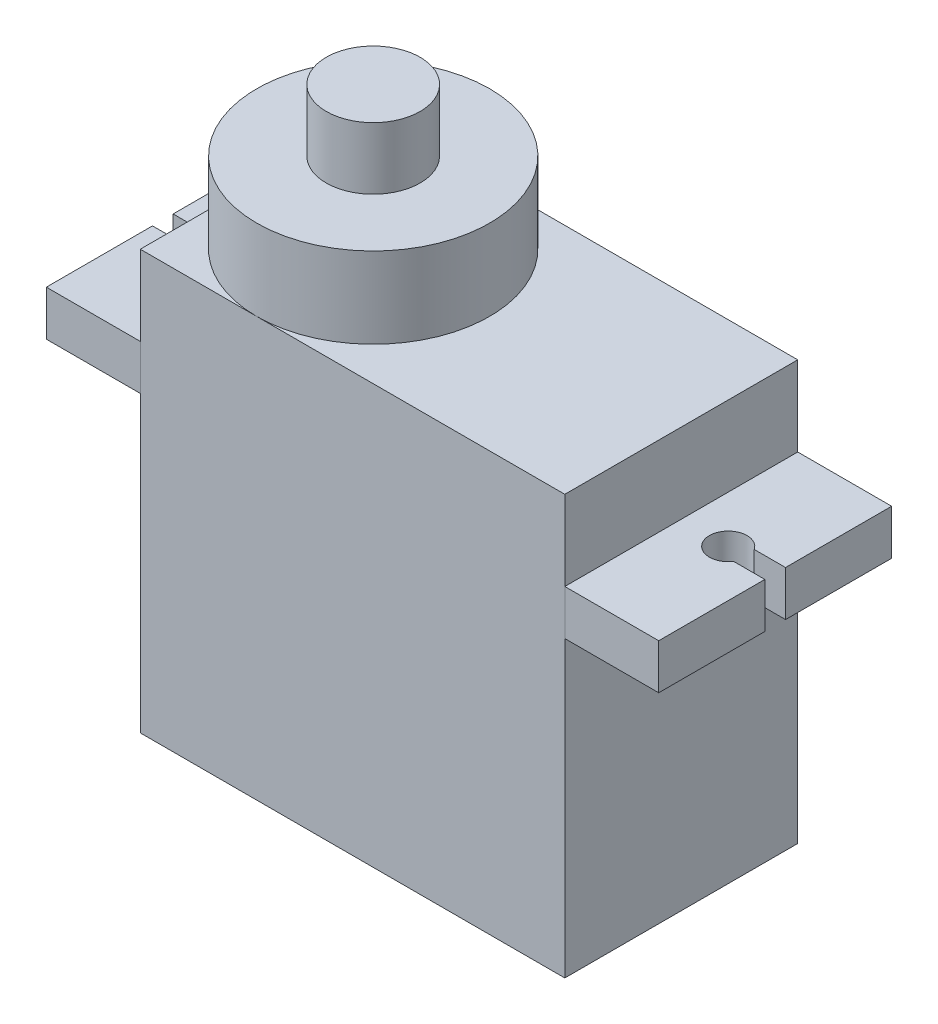
ISO-10303-21;
HEADER;
FILE_DESCRIPTION(('STEP AP214'),'2;1');
FILE_NAME('part.step','',(''),(''),'','','');
FILE_SCHEMA(('AUTOMOTIVE_DESIGN { 1 0 10303 214 1 1 1 1 }'));
ENDSEC;
DATA;
#1=APPLICATION_CONTEXT('core data for automotive mechanical design processes');
#2=APPLICATION_PROTOCOL_DEFINITION('international standard','automotive_design',2000,#1);
#3=PRODUCT_CONTEXT('',#1,'mechanical');
#4=PRODUCT('Part','Part','',(#3));
#5=PRODUCT_RELATED_PRODUCT_CATEGORY('part','',(#4));
#6=PRODUCT_DEFINITION_FORMATION('','',#4);
#7=PRODUCT_DEFINITION_CONTEXT('part definition',#1,'design');
#8=PRODUCT_DEFINITION('design','',#6,#7);
#9=PRODUCT_DEFINITION_SHAPE('','',#8);
#10=(LENGTH_UNIT() NAMED_UNIT(*) SI_UNIT(.MILLI.,.METRE.));
#11=(NAMED_UNIT(*) PLANE_ANGLE_UNIT() SI_UNIT($,.RADIAN.));
#12=(NAMED_UNIT(*) SI_UNIT($,.STERADIAN.) SOLID_ANGLE_UNIT());
#13=UNCERTAINTY_MEASURE_WITH_UNIT(LENGTH_MEASURE(1.E-05),#10,'distance_accuracy_value','');
#14=(GEOMETRIC_REPRESENTATION_CONTEXT(3) GLOBAL_UNCERTAINTY_ASSIGNED_CONTEXT((#13)) GLOBAL_UNIT_ASSIGNED_CONTEXT((#10,
#11,#12)) REPRESENTATION_CONTEXT('',''));
#15=CARTESIAN_POINT('',(0.,0.,0.));
#16=DIRECTION('',(0.,0.,1.));
#17=DIRECTION('',(1.,0.,0.));
#18=AXIS2_PLACEMENT_3D('',#15,#16,#17);
#19=CARTESIAN_POINT('',(-13.6,4.5,-1.2));
#20=DIRECTION('',(1.,0.,0.));
#21=DIRECTION('',(0.,0.,-1.));
#22=AXIS2_PLACEMENT_3D('',#19,#20,#21);
#23=CYLINDRICAL_SURFACE('',#22,0.6);
#24=CARTESIAN_POINT('',(-11.3,4.5,-1.2));
#25=DIRECTION('',(-1.,0.,0.));
#26=DIRECTION('',(0.,0.,1.));
#27=AXIS2_PLACEMENT_3D('',#24,#25,#26);
#28=CIRCLE('',#27,0.6);
#29=CARTESIAN_POINT('',(-11.3,4.5,-0.6));
#30=VERTEX_POINT('',#29);
#31=EDGE_CURVE('E11',#30,#30,#28,.T.);
#32=ORIENTED_EDGE('',*,*,#31,.T.);
#33=EDGE_LOOP('',(#32));
#34=FACE_BOUND('',#33,.T.);
#35=CARTESIAN_POINT('',(-13.6,4.5,-1.2));
#36=DIRECTION('',(-1.,0.,0.));
#37=DIRECTION('',(0.,0.,1.));
#38=AXIS2_PLACEMENT_3D('',#35,#36,#37);
#39=CIRCLE('',#38,0.6);
#40=CARTESIAN_POINT('',(-13.6,4.5,-0.6));
#41=VERTEX_POINT('',#40);
#42=EDGE_CURVE('E60',#41,#41,#39,.T.);
#43=ORIENTED_EDGE('',*,*,#42,.F.);
#44=EDGE_LOOP('',(#43));
#45=FACE_BOUND('',#44,.T.);
#46=ADVANCED_FACE('F56',(#34,#45),#23,.T.);
#47=CARTESIAN_POINT('',(-13.6,0.,0.));
#48=DIRECTION('',(-1.,0.,0.));
#49=DIRECTION('',(0.,0.,1.));
#50=AXIS2_PLACEMENT_3D('',#47,#48,#49);
#51=PLANE('',#50);
#52=ORIENTED_EDGE('',*,*,#42,.T.);
#53=EDGE_LOOP('',(#52));
#54=FACE_BOUND('',#53,.T.);
#55=ADVANCED_FACE('F58',(#54),#51,.T.);
#56=CARTESIAN_POINT('',(-11.3,0.,0.));
#57=DIRECTION('',(-1.,0.,0.));
#58=DIRECTION('',(0.,0.,1.));
#59=AXIS2_PLACEMENT_3D('',#56,#57,#58);
#60=PLANE('',#59);
#61=ORIENTED_EDGE('',*,*,#31,.F.);
#62=EDGE_LOOP('',(#61));
#63=FACE_BOUND('',#62,.T.);
#64=ADVANCED_FACE('F75',(#63),#60,.F.);
#65=CLOSED_SHELL('',(#46,#55,#64));
#66=MANIFOLD_SOLID_BREP('B2',#65);
#67=CARTESIAN_POINT('',(-13.6,4.5,0.));
#68=DIRECTION('',(1.,0.,0.));
#69=DIRECTION('',(0.,0.,-1.));
#70=AXIS2_PLACEMENT_3D('',#67,#68,#69);
#71=CYLINDRICAL_SURFACE('',#70,0.6);
#72=CARTESIAN_POINT('',(-11.3,4.5,0.));
#73=DIRECTION('',(-1.,0.,0.));
#74=DIRECTION('',(0.,0.,1.));
#75=AXIS2_PLACEMENT_3D('',#72,#73,#74);
#76=CIRCLE('',#75,0.6);
#77=CARTESIAN_POINT('',(-11.3,4.5,0.6));
#78=VERTEX_POINT('',#77);
#79=EDGE_CURVE('E55',#78,#78,#76,.T.);
#80=ORIENTED_EDGE('',*,*,#79,.T.);
#81=EDGE_LOOP('',(#80));
#82=FACE_BOUND('',#81,.T.);
#83=CARTESIAN_POINT('',(-13.6,4.5,0.));
#84=DIRECTION('',(-1.,0.,0.));
#85=DIRECTION('',(0.,0.,1.));
#86=AXIS2_PLACEMENT_3D('',#83,#84,#85);
#87=CIRCLE('',#86,0.6);
#88=CARTESIAN_POINT('',(-13.6,4.5,0.6));
#89=VERTEX_POINT('',#88);
#90=EDGE_CURVE('E109',#89,#89,#87,.T.);
#91=ORIENTED_EDGE('',*,*,#90,.F.);
#92=EDGE_LOOP('',(#91));
#93=FACE_BOUND('',#92,.T.);
#94=ADVANCED_FACE('F105',(#82,#93),#71,.T.);
#95=CARTESIAN_POINT('',(-13.6,0.,0.));
#96=DIRECTION('',(-1.,0.,0.));
#97=DIRECTION('',(0.,0.,1.));
#98=AXIS2_PLACEMENT_3D('',#95,#96,#97);
#99=PLANE('',#98);
#100=ORIENTED_EDGE('',*,*,#90,.T.);
#101=EDGE_LOOP('',(#100));
#102=FACE_BOUND('',#101,.T.);
#103=ADVANCED_FACE('F107',(#102),#99,.T.);
#104=CARTESIAN_POINT('',(-11.3,0.,0.));
#105=DIRECTION('',(-1.,0.,0.));
#106=DIRECTION('',(0.,0.,1.));
#107=AXIS2_PLACEMENT_3D('',#104,#105,#106);
#108=PLANE('',#107);
#109=ORIENTED_EDGE('',*,*,#79,.F.);
#110=EDGE_LOOP('',(#109));
#111=FACE_BOUND('',#110,.T.);
#112=ADVANCED_FACE('F124',(#111),#108,.F.);
#113=CLOSED_SHELL('',(#94,#103,#112));
#114=MANIFOLD_SOLID_BREP('B6',#113);
#115=CARTESIAN_POINT('',(-13.6,4.5,1.2));
#116=DIRECTION('',(1.,0.,0.));
#117=DIRECTION('',(0.,0.,-1.));
#118=AXIS2_PLACEMENT_3D('',#115,#116,#117);
#119=CYLINDRICAL_SURFACE('',#118,0.6);
#120=CARTESIAN_POINT('',(-11.3,4.5,1.2));
#121=DIRECTION('',(-1.,0.,0.));
#122=DIRECTION('',(0.,0.,1.));
#123=AXIS2_PLACEMENT_3D('',#120,#121,#122);
#124=CIRCLE('',#123,0.6);
#125=CARTESIAN_POINT('',(-11.3,4.5,1.8));
#126=VERTEX_POINT('',#125);
#127=EDGE_CURVE('E159',#126,#126,#124,.T.);
#128=ORIENTED_EDGE('',*,*,#127,.T.);
#129=EDGE_LOOP('',(#128));
#130=FACE_BOUND('',#129,.T.);
#131=CARTESIAN_POINT('',(-13.6,4.5,1.2));
#132=DIRECTION('',(-1.,0.,0.));
#133=DIRECTION('',(0.,0.,1.));
#134=AXIS2_PLACEMENT_3D('',#131,#132,#133);
#135=CIRCLE('',#134,0.6);
#136=CARTESIAN_POINT('',(-13.6,4.5,1.8));
#137=VERTEX_POINT('',#136);
#138=EDGE_CURVE('E104',#137,#137,#135,.T.);
#139=ORIENTED_EDGE('',*,*,#138,.F.);
#140=EDGE_LOOP('',(#139));
#141=FACE_BOUND('',#140,.T.);
#142=ADVANCED_FACE('F156',(#130,#141),#119,.T.);
#143=CARTESIAN_POINT('',(-13.6,4.5,1.2));
#144=DIRECTION('',(-1.,0.,0.));
#145=DIRECTION('',(0.,0.,1.));
#146=AXIS2_PLACEMENT_3D('',#143,#144,#145);
#147=PLANE('',#146);
#148=ORIENTED_EDGE('',*,*,#138,.T.);
#149=EDGE_LOOP('',(#148));
#150=FACE_BOUND('',#149,.T.);
#151=ADVANCED_FACE('F172',(#150),#147,.T.);
#152=CARTESIAN_POINT('',(-11.3,4.5,1.2));
#153=DIRECTION('',(-1.,0.,0.));
#154=DIRECTION('',(0.,0.,1.));
#155=AXIS2_PLACEMENT_3D('',#152,#153,#154);
#156=PLANE('',#155);
#157=ORIENTED_EDGE('',*,*,#127,.F.);
#158=EDGE_LOOP('',(#157));
#159=FACE_BOUND('',#158,.T.);
#160=ADVANCED_FACE('F170',(#159),#156,.F.);
#161=CLOSED_SHELL('',(#142,#151,#160));
#162=MANIFOLD_SOLID_BREP('B50',#161);
#163=CARTESIAN_POINT('',(-16.3,18.05,-6.2));
#164=DIRECTION('',(-1.,0.,0.));
#165=DIRECTION('',(0.,0.,1.));
#166=AXIS2_PLACEMENT_3D('',#163,#164,#165);
#167=PLANE('',#166);
#168=DIRECTION('',(0.,1.,0.));
#169=VECTOR('',#168,1.);
#170=CARTESIAN_POINT('',(-16.3,0.,0.550000000000012));
#171=LINE('',#170,#169);
#172=CARTESIAN_POINT('',(-16.3,15.65,0.550000000000012));
#173=VERTEX_POINT('',#172);
#174=CARTESIAN_POINT('',(-16.3,18.05,0.550000000000012));
#175=VERTEX_POINT('',#174);
#176=EDGE_CURVE('E295',#173,#175,#171,.T.);
#177=ORIENTED_EDGE('',*,*,#176,.F.);
#178=DIRECTION('',(0.,0.,1.));
#179=VECTOR('',#178,1.);
#180=CARTESIAN_POINT('',(-16.3,15.65,-6.2));
#181=LINE('',#180,#179);
#182=CARTESIAN_POINT('',(-16.3,15.65,6.2));
#183=VERTEX_POINT('',#182);
#184=EDGE_CURVE('E300',#173,#183,#181,.T.);
#185=ORIENTED_EDGE('',*,*,#184,.T.);
#186=DIRECTION('',(0.,-1.,0.));
#187=VECTOR('',#186,1.);
#188=CARTESIAN_POINT('',(-16.3,18.05,6.2));
#189=LINE('',#188,#187);
#190=CARTESIAN_POINT('',(-16.3,18.05,6.2));
#191=VERTEX_POINT('',#190);
#192=EDGE_CURVE('E308',#191,#183,#189,.T.);
#193=ORIENTED_EDGE('',*,*,#192,.F.);
#194=DIRECTION('',(0.,0.,1.));
#195=VECTOR('',#194,1.);
#196=CARTESIAN_POINT('',(-16.3,18.05,-6.2));
#197=LINE('',#196,#195);
#198=EDGE_CURVE('E301',#175,#191,#197,.T.);
#199=ORIENTED_EDGE('',*,*,#198,.F.);
#200=EDGE_LOOP('',(#177,#185,#193,#199));
#201=FACE_BOUND('',#200,.T.);
#202=ADVANCED_FACE('F207',(#201),#167,.T.);
#203=CARTESIAN_POINT('',(-11.3,18.05,-6.2));
#204=DIRECTION('',(1.,0.,0.));
#205=DIRECTION('',(0.,0.,-1.));
#206=AXIS2_PLACEMENT_3D('',#203,#204,#205);
#207=PLANE('',#206);
#208=DIRECTION('',(0.,1.,0.));
#209=VECTOR('',#208,1.);
#210=CARTESIAN_POINT('',(-11.3,18.05,6.2));
#211=LINE('',#210,#209);
#212=CARTESIAN_POINT('',(-11.3,15.65,6.2));
#213=VERTEX_POINT('',#212);
#214=CARTESIAN_POINT('',(-11.3,18.05,6.2));
#215=VERTEX_POINT('',#214);
#216=EDGE_CURVE('E314',#213,#215,#211,.T.);
#217=ORIENTED_EDGE('',*,*,#216,.F.);
#218=DIRECTION('',(0.,0.,1.));
#219=VECTOR('',#218,1.);
#220=CARTESIAN_POINT('',(-11.3,15.65,-6.2));
#221=LINE('',#220,#219);
#222=CARTESIAN_POINT('',(-11.3,15.65,-6.2));
#223=VERTEX_POINT('',#222);
#224=EDGE_CURVE('E154',#223,#213,#221,.T.);
#225=ORIENTED_EDGE('',*,*,#224,.F.);
#226=DIRECTION('',(0.,1.,0.));
#227=VECTOR('',#226,1.);
#228=CARTESIAN_POINT('',(-11.3,18.05,-6.2));
#229=LINE('',#228,#227);
#230=CARTESIAN_POINT('',(-11.3,18.05,-6.2));
#231=VERTEX_POINT('',#230);
#232=EDGE_CURVE('E307',#223,#231,#229,.T.);
#233=ORIENTED_EDGE('',*,*,#232,.T.);
#234=DIRECTION('',(0.,0.,1.));
#235=VECTOR('',#234,1.);
#236=CARTESIAN_POINT('',(-11.3,18.05,-6.2));
#237=LINE('',#236,#235);
#238=EDGE_CURVE('E211',#231,#215,#237,.T.);
#239=ORIENTED_EDGE('',*,*,#238,.T.);
#240=EDGE_LOOP('',(#217,#225,#233,#239));
#241=FACE_BOUND('',#240,.T.);
#242=ADVANCED_FACE('F209',(#241),#207,.T.);
#243=CARTESIAN_POINT('',(-11.3,15.65,-6.2));
#244=DIRECTION('',(0.,-1.,0.));
#245=DIRECTION('',(0.,0.,-1.));
#246=AXIS2_PLACEMENT_3D('',#243,#244,#245);
#247=PLANE('',#246);
#248=DIRECTION('',(-1.,0.,0.));
#249=VECTOR('',#248,1.);
#250=CARTESIAN_POINT('',(-11.3,15.65,0.55000000000001));
#251=LINE('',#250,#249);
#252=CARTESIAN_POINT('',(-14.6351646544245,15.65,0.550000000000011));
#253=VERTEX_POINT('',#252);
#254=EDGE_CURVE('E325',#253,#173,#251,.T.);
#255=ORIENTED_EDGE('',*,*,#254,.F.);
#256=CARTESIAN_POINT('',(-13.8,15.65,0.));
#257=DIRECTION('',(0.,-1.,0.));
#258=DIRECTION('',(0.,0.,-1.));
#259=AXIS2_PLACEMENT_3D('',#256,#257,#258);
#260=CIRCLE('',#259,1.);
#261=CARTESIAN_POINT('',(-14.6351646544245,15.65,-0.550000000000004));
#262=VERTEX_POINT('',#261);
#263=EDGE_CURVE('E317',#262,#253,#260,.T.);
#264=ORIENTED_EDGE('',*,*,#263,.F.);
#265=DIRECTION('',(1.,0.,0.));
#266=VECTOR('',#265,1.);
#267=CARTESIAN_POINT('',(-11.3,15.65,-0.550000000000004));
#268=LINE('',#267,#266);
#269=CARTESIAN_POINT('',(-16.3,15.65,-0.550000000000004));
#270=VERTEX_POINT('',#269);
#271=EDGE_CURVE('E327',#270,#262,#268,.T.);
#272=ORIENTED_EDGE('',*,*,#271,.F.);
#273=CARTESIAN_POINT('',(-16.3,15.65,-6.2));
#274=VERTEX_POINT('',#273);
#275=EDGE_CURVE('E216',#274,#270,#181,.T.);
#276=ORIENTED_EDGE('',*,*,#275,.F.);
#277=DIRECTION('',(1.,0.,0.));
#278=VECTOR('',#277,1.);
#279=CARTESIAN_POINT('',(-11.3,15.65,-6.2));
#280=LINE('',#279,#278);
#281=EDGE_CURVE('E318',#274,#223,#280,.T.);
#282=ORIENTED_EDGE('',*,*,#281,.T.);
#283=ORIENTED_EDGE('',*,*,#224,.T.);
#284=DIRECTION('',(1.,0.,0.));
#285=VECTOR('',#284,1.);
#286=CARTESIAN_POINT('',(-11.3,15.65,6.2));
#287=LINE('',#286,#285);
#288=EDGE_CURVE('E304',#183,#213,#287,.T.);
#289=ORIENTED_EDGE('',*,*,#288,.F.);
#290=ORIENTED_EDGE('',*,*,#184,.F.);
#291=EDGE_LOOP('',(#255,#264,#272,#276,#282,#283,#289,#290));
#292=FACE_BOUND('',#291,.T.);
#293=ADVANCED_FACE('F349',(#292),#247,.T.);
#294=DIRECTION('',(0.,1.,0.));
#295=VECTOR('',#294,1.);
#296=CARTESIAN_POINT('',(-16.3,0.,-0.550000000000004));
#297=LINE('',#296,#295);
#298=CARTESIAN_POINT('',(-16.3,18.05,-0.550000000000004));
#299=VERTEX_POINT('',#298);
#300=EDGE_CURVE('E283',#270,#299,#297,.T.);
#301=ORIENTED_EDGE('',*,*,#300,.T.);
#302=CARTESIAN_POINT('',(-16.3,18.05,-6.2));
#303=VERTEX_POINT('',#302);
#304=EDGE_CURVE('E293',#303,#299,#197,.T.);
#305=ORIENTED_EDGE('',*,*,#304,.F.);
#306=DIRECTION('',(0.,-1.,0.));
#307=VECTOR('',#306,1.);
#308=CARTESIAN_POINT('',(-16.3,18.05,-6.2));
#309=LINE('',#308,#307);
#310=EDGE_CURVE('E320',#303,#274,#309,.T.);
#311=ORIENTED_EDGE('',*,*,#310,.T.);
#312=ORIENTED_EDGE('',*,*,#275,.T.);
#313=EDGE_LOOP('',(#301,#305,#311,#312));
#314=FACE_BOUND('',#313,.T.);
#315=ADVANCED_FACE('F291',(#314),#167,.T.);
#316=CARTESIAN_POINT('',(-11.3,18.05,-6.2));
#317=DIRECTION('',(0.,1.,0.));
#318=DIRECTION('',(0.,0.,1.));
#319=AXIS2_PLACEMENT_3D('',#316,#317,#318);
#320=PLANE('',#319);
#321=DIRECTION('',(1.,0.,0.));
#322=VECTOR('',#321,1.);
#323=CARTESIAN_POINT('',(-14.6351646544245,18.05,0.550000000000011));
#324=LINE('',#323,#322);
#325=CARTESIAN_POINT('',(-14.6351646544245,18.05,0.550000000000011));
#326=VERTEX_POINT('',#325);
#327=EDGE_CURVE('E287',#175,#326,#324,.T.);
#328=ORIENTED_EDGE('',*,*,#327,.F.);
#329=ORIENTED_EDGE('',*,*,#198,.T.);
#330=DIRECTION('',(-1.,0.,0.));
#331=VECTOR('',#330,1.);
#332=CARTESIAN_POINT('',(-11.3,18.05,6.2));
#333=LINE('',#332,#331);
#334=EDGE_CURVE('E311',#215,#191,#333,.T.);
#335=ORIENTED_EDGE('',*,*,#334,.F.);
#336=ORIENTED_EDGE('',*,*,#238,.F.);
#337=DIRECTION('',(-1.,0.,0.));
#338=VECTOR('',#337,1.);
#339=CARTESIAN_POINT('',(-11.3,18.05,-6.2));
#340=LINE('',#339,#338);
#341=EDGE_CURVE('E299',#231,#303,#340,.T.);
#342=ORIENTED_EDGE('',*,*,#341,.T.);
#343=ORIENTED_EDGE('',*,*,#304,.T.);
#344=DIRECTION('',(-1.,0.,0.));
#345=VECTOR('',#344,1.);
#346=CARTESIAN_POINT('',(-16.3,18.05,-0.550000000000004));
#347=LINE('',#346,#345);
#348=CARTESIAN_POINT('',(-14.6351646544245,18.05,-0.550000000000004));
#349=VERTEX_POINT('',#348);
#350=EDGE_CURVE('E280',#349,#299,#347,.T.);
#351=ORIENTED_EDGE('',*,*,#350,.F.);
#352=CARTESIAN_POINT('',(-13.8,18.05,0.));
#353=DIRECTION('',(0.,1.,0.));
#354=DIRECTION('',(0.,0.,-1.));
#355=AXIS2_PLACEMENT_3D('',#352,#353,#354);
#356=CIRCLE('',#355,1.);
#357=EDGE_CURVE('E224',#326,#349,#356,.T.);
#358=ORIENTED_EDGE('',*,*,#357,.F.);
#359=EDGE_LOOP('',(#328,#329,#335,#336,#342,#343,#351,#358));
#360=FACE_BOUND('',#359,.T.);
#361=ADVANCED_FACE('F298',(#360),#320,.T.);
#362=CARTESIAN_POINT('',(0.,0.,-6.2));
#363=DIRECTION('',(0.,0.,-1.));
#364=DIRECTION('',(-1.,0.,0.));
#365=AXIS2_PLACEMENT_3D('',#362,#363,#364);
#366=PLANE('',#365);
#367=ORIENTED_EDGE('',*,*,#232,.F.);
#368=ORIENTED_EDGE('',*,*,#281,.F.);
#369=ORIENTED_EDGE('',*,*,#310,.F.);
#370=ORIENTED_EDGE('',*,*,#341,.F.);
#371=EDGE_LOOP('',(#367,#368,#369,#370));
#372=FACE_BOUND('',#371,.T.);
#373=ADVANCED_FACE('F348',(#372),#366,.T.);
#374=CARTESIAN_POINT('',(0.,0.,6.2));
#375=DIRECTION('',(0.,0.,-1.));
#376=DIRECTION('',(-1.,0.,0.));
#377=AXIS2_PLACEMENT_3D('',#374,#375,#376);
#378=PLANE('',#377);
#379=ORIENTED_EDGE('',*,*,#216,.T.);
#380=ORIENTED_EDGE('',*,*,#334,.T.);
#381=ORIENTED_EDGE('',*,*,#192,.T.);
#382=ORIENTED_EDGE('',*,*,#288,.T.);
#383=EDGE_LOOP('',(#379,#380,#381,#382));
#384=FACE_BOUND('',#383,.T.);
#385=ADVANCED_FACE('F345',(#384),#378,.F.);
#386=CARTESIAN_POINT('',(-13.8,0.,0.));
#387=DIRECTION('',(0.,1.,0.));
#388=DIRECTION('',(0.,0.,1.));
#389=AXIS2_PLACEMENT_3D('',#386,#387,#388);
#390=CYLINDRICAL_SURFACE('',#389,1.);
#391=ORIENTED_EDGE('',*,*,#263,.T.);
#392=DIRECTION('',(0.,1.,0.));
#393=VECTOR('',#392,1.);
#394=CARTESIAN_POINT('',(-14.6351646544245,0.,0.550000000000011));
#395=LINE('',#394,#393);
#396=EDGE_CURVE('E329',#253,#326,#395,.T.);
#397=ORIENTED_EDGE('',*,*,#396,.T.);
#398=ORIENTED_EDGE('',*,*,#357,.T.);
#399=DIRECTION('',(0.,1.,0.));
#400=VECTOR('',#399,1.);
#401=CARTESIAN_POINT('',(-14.6351646544245,0.,-0.550000000000004));
#402=LINE('',#401,#400);
#403=EDGE_CURVE('E285',#262,#349,#402,.T.);
#404=ORIENTED_EDGE('',*,*,#403,.F.);
#405=EDGE_LOOP('',(#391,#397,#398,#404));
#406=FACE_BOUND('',#405,.T.);
#407=ADVANCED_FACE('F351',(#406),#390,.F.);
#408=CARTESIAN_POINT('',(-14.6351646544245,0.,0.550000000000011));
#409=DIRECTION('',(0.,0.,1.));
#410=DIRECTION('',(1.,0.,0.));
#411=AXIS2_PLACEMENT_3D('',#408,#409,#410);
#412=PLANE('',#411);
#413=ORIENTED_EDGE('',*,*,#254,.T.);
#414=ORIENTED_EDGE('',*,*,#176,.T.);
#415=ORIENTED_EDGE('',*,*,#327,.T.);
#416=ORIENTED_EDGE('',*,*,#396,.F.);
#417=EDGE_LOOP('',(#413,#414,#415,#416));
#418=FACE_BOUND('',#417,.T.);
#419=ADVANCED_FACE('F337',(#418),#412,.F.);
#420=CARTESIAN_POINT('',(-16.3,0.,-0.550000000000004));
#421=DIRECTION('',(0.,0.,-1.));
#422=DIRECTION('',(-1.,0.,0.));
#423=AXIS2_PLACEMENT_3D('',#420,#421,#422);
#424=PLANE('',#423);
#425=ORIENTED_EDGE('',*,*,#271,.T.);
#426=ORIENTED_EDGE('',*,*,#403,.T.);
#427=ORIENTED_EDGE('',*,*,#350,.T.);
#428=ORIENTED_EDGE('',*,*,#300,.F.);
#429=EDGE_LOOP('',(#425,#426,#427,#428));
#430=FACE_BOUND('',#429,.T.);
#431=ADVANCED_FACE('F282',(#430),#424,.F.);
#432=CLOSED_SHELL('',(#202,#242,#293,#315,#361,#373,#385,#407,#419,#431));
#433=MANIFOLD_SOLID_BREP('B99',#432);
#434=CARTESIAN_POINT('',(16.3,18.05,-6.2));
#435=DIRECTION('',(1.,0.,0.));
#436=DIRECTION('',(0.,0.,-1.));
#437=AXIS2_PLACEMENT_3D('',#434,#435,#436);
#438=PLANE('',#437);
#439=DIRECTION('',(0.,1.,0.));
#440=VECTOR('',#439,1.);
#441=CARTESIAN_POINT('',(16.3,0.,-0.550000000000004));
#442=LINE('',#441,#440);
#443=CARTESIAN_POINT('',(16.3,15.65,-0.550000000000004));
#444=VERTEX_POINT('',#443);
#445=CARTESIAN_POINT('',(16.3,18.05,-0.550000000000004));
#446=VERTEX_POINT('',#445);
#447=EDGE_CURVE('E538',#444,#446,#442,.T.);
#448=ORIENTED_EDGE('',*,*,#447,.F.);
#449=DIRECTION('',(0.,0.,1.));
#450=VECTOR('',#449,1.);
#451=CARTESIAN_POINT('',(16.3,15.65,-6.2));
#452=LINE('',#451,#450);
#453=CARTESIAN_POINT('',(16.3,15.65,-6.2));
#454=VERTEX_POINT('',#453);
#455=EDGE_CURVE('E565',#454,#444,#452,.T.);
#456=ORIENTED_EDGE('',*,*,#455,.F.);
#457=DIRECTION('',(0.,1.,0.));
#458=VECTOR('',#457,1.);
#459=CARTESIAN_POINT('',(16.3,18.05,-6.2));
#460=LINE('',#459,#458);
#461=CARTESIAN_POINT('',(16.3,18.05,-6.2));
#462=VERTEX_POINT('',#461);
#463=EDGE_CURVE('E546',#454,#462,#460,.T.);
#464=ORIENTED_EDGE('',*,*,#463,.T.);
#465=DIRECTION('',(0.,0.,1.));
#466=VECTOR('',#465,1.);
#467=CARTESIAN_POINT('',(16.3,18.05,-6.2));
#468=LINE('',#467,#466);
#469=EDGE_CURVE('E562',#462,#446,#468,.T.);
#470=ORIENTED_EDGE('',*,*,#469,.T.);
#471=EDGE_LOOP('',(#448,#456,#464,#470));
#472=FACE_BOUND('',#471,.T.);
#473=ADVANCED_FACE('F441',(#472),#438,.T.);
#474=CARTESIAN_POINT('',(11.3,18.05,-6.2));
#475=DIRECTION('',(-1.,0.,0.));
#476=DIRECTION('',(0.,0.,1.));
#477=AXIS2_PLACEMENT_3D('',#474,#475,#476);
#478=PLANE('',#477);
#479=DIRECTION('',(0.,-1.,0.));
#480=VECTOR('',#479,1.);
#481=CARTESIAN_POINT('',(11.3,18.05,6.2));
#482=LINE('',#481,#480);
#483=CARTESIAN_POINT('',(11.3,18.05,6.2));
#484=VERTEX_POINT('',#483);
#485=CARTESIAN_POINT('',(11.3,15.65,6.2));
#486=VERTEX_POINT('',#485);
#487=EDGE_CURVE('E537',#484,#486,#482,.T.);
#488=ORIENTED_EDGE('',*,*,#487,.F.);
#489=DIRECTION('',(0.,0.,1.));
#490=VECTOR('',#489,1.);
#491=CARTESIAN_POINT('',(11.3,18.05,-6.2));
#492=LINE('',#491,#490);
#493=CARTESIAN_POINT('',(11.3,18.05,-6.2));
#494=VERTEX_POINT('',#493);
#495=EDGE_CURVE('E465',#494,#484,#492,.T.);
#496=ORIENTED_EDGE('',*,*,#495,.F.);
#497=DIRECTION('',(0.,-1.,0.));
#498=VECTOR('',#497,1.);
#499=CARTESIAN_POINT('',(11.3,18.05,-6.2));
#500=LINE('',#499,#498);
#501=CARTESIAN_POINT('',(11.3,15.65,-6.2));
#502=VERTEX_POINT('',#501);
#503=EDGE_CURVE('E541',#494,#502,#500,.T.);
#504=ORIENTED_EDGE('',*,*,#503,.T.);
#505=DIRECTION('',(0.,0.,1.));
#506=VECTOR('',#505,1.);
#507=CARTESIAN_POINT('',(11.3,15.65,-6.2));
#508=LINE('',#507,#506);
#509=EDGE_CURVE('E491',#502,#486,#508,.T.);
#510=ORIENTED_EDGE('',*,*,#509,.T.);
#511=EDGE_LOOP('',(#488,#496,#504,#510));
#512=FACE_BOUND('',#511,.T.);
#513=ADVANCED_FACE('F443',(#512),#478,.T.);
#514=CARTESIAN_POINT('',(11.3,18.05,-6.2));
#515=DIRECTION('',(0.,1.,0.));
#516=DIRECTION('',(0.,0.,1.));
#517=AXIS2_PLACEMENT_3D('',#514,#515,#516);
#518=PLANE('',#517);
#519=DIRECTION('',(-1.,0.,0.));
#520=VECTOR('',#519,1.);
#521=CARTESIAN_POINT('',(14.6351646544245,18.05,-0.550000000000004));
#522=LINE('',#521,#520);
#523=CARTESIAN_POINT('',(14.6351646544245,18.05,-0.550000000000004));
#524=VERTEX_POINT('',#523);
#525=EDGE_CURVE('E520',#446,#524,#522,.T.);
#526=ORIENTED_EDGE('',*,*,#525,.F.);
#527=ORIENTED_EDGE('',*,*,#469,.F.);
#528=DIRECTION('',(-1.,0.,0.));
#529=VECTOR('',#528,1.);
#530=CARTESIAN_POINT('',(11.3,18.05,-6.2));
#531=LINE('',#530,#529);
#532=EDGE_CURVE('E549',#462,#494,#531,.T.);
#533=ORIENTED_EDGE('',*,*,#532,.T.);
#534=ORIENTED_EDGE('',*,*,#495,.T.);
#535=DIRECTION('',(-1.,0.,0.));
#536=VECTOR('',#535,1.);
#537=CARTESIAN_POINT('',(11.3,18.05,6.2));
#538=LINE('',#537,#536);
#539=CARTESIAN_POINT('',(16.3,18.05,6.2));
#540=VERTEX_POINT('',#539);
#541=EDGE_CURVE('E544',#540,#484,#538,.T.);
#542=ORIENTED_EDGE('',*,*,#541,.F.);
#543=CARTESIAN_POINT('',(16.3,18.05,0.549999999999996));
#544=VERTEX_POINT('',#543);
#545=EDGE_CURVE('E532',#544,#540,#468,.T.);
#546=ORIENTED_EDGE('',*,*,#545,.F.);
#547=DIRECTION('',(1.,0.,0.));
#548=VECTOR('',#547,1.);
#549=CARTESIAN_POINT('',(16.3,18.05,0.549999999999996));
#550=LINE('',#549,#548);
#551=CARTESIAN_POINT('',(14.6351646544245,18.05,0.549999999999997));
#552=VERTEX_POINT('',#551);
#553=EDGE_CURVE('E516',#552,#544,#550,.T.);
#554=ORIENTED_EDGE('',*,*,#553,.F.);
#555=CARTESIAN_POINT('',(13.8,18.05,0.));
#556=DIRECTION('',(0.,1.,0.));
#557=DIRECTION('',(0.,0.,1.));
#558=AXIS2_PLACEMENT_3D('',#555,#556,#557);
#559=CIRCLE('',#558,1.);
#560=EDGE_CURVE('E523',#524,#552,#559,.T.);
#561=ORIENTED_EDGE('',*,*,#560,.F.);
#562=EDGE_LOOP('',(#526,#527,#533,#534,#542,#546,#554,#561));
#563=FACE_BOUND('',#562,.T.);
#564=ADVANCED_FACE('F531',(#563),#518,.T.);
#565=DIRECTION('',(0.,1.,0.));
#566=VECTOR('',#565,1.);
#567=CARTESIAN_POINT('',(16.3,0.,0.549999999999996));
#568=LINE('',#567,#566);
#569=CARTESIAN_POINT('',(16.3,15.65,0.549999999999994));
#570=VERTEX_POINT('',#569);
#571=EDGE_CURVE('E456',#570,#544,#568,.T.);
#572=ORIENTED_EDGE('',*,*,#571,.T.);
#573=ORIENTED_EDGE('',*,*,#545,.T.);
#574=DIRECTION('',(0.,1.,0.));
#575=VECTOR('',#574,1.);
#576=CARTESIAN_POINT('',(16.3,18.05,6.2));
#577=LINE('',#576,#575);
#578=CARTESIAN_POINT('',(16.3,15.65,6.2));
#579=VERTEX_POINT('',#578);
#580=EDGE_CURVE('E556',#579,#540,#577,.T.);
#581=ORIENTED_EDGE('',*,*,#580,.F.);
#582=EDGE_CURVE('E568',#570,#579,#452,.T.);
#583=ORIENTED_EDGE('',*,*,#582,.F.);
#584=EDGE_LOOP('',(#572,#573,#581,#583));
#585=FACE_BOUND('',#584,.T.);
#586=ADVANCED_FACE('F585',(#585),#438,.T.);
#587=CARTESIAN_POINT('',(11.3,15.65,-6.2));
#588=DIRECTION('',(0.,-1.,0.));
#589=DIRECTION('',(0.,0.,-1.));
#590=AXIS2_PLACEMENT_3D('',#587,#588,#589);
#591=PLANE('',#590);
#592=DIRECTION('',(1.,0.,0.));
#593=VECTOR('',#592,1.);
#594=CARTESIAN_POINT('',(11.3,15.65,-0.550000000000004));
#595=LINE('',#594,#593);
#596=CARTESIAN_POINT('',(14.6351646544245,15.65,-0.550000000000004));
#597=VERTEX_POINT('',#596);
#598=EDGE_CURVE('E205',#597,#444,#595,.T.);
#599=ORIENTED_EDGE('',*,*,#598,.F.);
#600=CARTESIAN_POINT('',(13.8,15.65,0.));
#601=DIRECTION('',(0.,-1.,0.));
#602=DIRECTION('',(0.,0.,-1.));
#603=AXIS2_PLACEMENT_3D('',#600,#601,#602);
#604=CIRCLE('',#603,1.);
#605=CARTESIAN_POINT('',(14.6351646544245,15.65,0.549999999999997));
#606=VERTEX_POINT('',#605);
#607=EDGE_CURVE('E449',#606,#597,#604,.T.);
#608=ORIENTED_EDGE('',*,*,#607,.F.);
#609=DIRECTION('',(-1.,0.,0.));
#610=VECTOR('',#609,1.);
#611=CARTESIAN_POINT('',(11.3,15.65,0.549999999999998));
#612=LINE('',#611,#610);
#613=EDGE_CURVE('E517',#570,#606,#612,.T.);
#614=ORIENTED_EDGE('',*,*,#613,.F.);
#615=ORIENTED_EDGE('',*,*,#582,.T.);
#616=DIRECTION('',(1.,0.,0.));
#617=VECTOR('',#616,1.);
#618=CARTESIAN_POINT('',(11.3,15.65,6.2));
#619=LINE('',#618,#617);
#620=EDGE_CURVE('E553',#486,#579,#619,.T.);
#621=ORIENTED_EDGE('',*,*,#620,.F.);
#622=ORIENTED_EDGE('',*,*,#509,.F.);
#623=DIRECTION('',(1.,0.,0.));
#624=VECTOR('',#623,1.);
#625=CARTESIAN_POINT('',(11.3,15.65,-6.2));
#626=LINE('',#625,#624);
#627=EDGE_CURVE('E543',#502,#454,#626,.T.);
#628=ORIENTED_EDGE('',*,*,#627,.T.);
#629=ORIENTED_EDGE('',*,*,#455,.T.);
#630=EDGE_LOOP('',(#599,#608,#614,#615,#621,#622,#628,#629));
#631=FACE_BOUND('',#630,.T.);
#632=ADVANCED_FACE('F574',(#631),#591,.T.);
#633=CARTESIAN_POINT('',(0.,0.,-6.2));
#634=DIRECTION('',(0.,0.,1.));
#635=DIRECTION('',(1.,0.,0.));
#636=AXIS2_PLACEMENT_3D('',#633,#634,#635);
#637=PLANE('',#636);
#638=ORIENTED_EDGE('',*,*,#503,.F.);
#639=ORIENTED_EDGE('',*,*,#532,.F.);
#640=ORIENTED_EDGE('',*,*,#463,.F.);
#641=ORIENTED_EDGE('',*,*,#627,.F.);
#642=EDGE_LOOP('',(#638,#639,#640,#641));
#643=FACE_BOUND('',#642,.T.);
#644=ADVANCED_FACE('F579',(#643),#637,.F.);
#645=CARTESIAN_POINT('',(0.,0.,6.2));
#646=DIRECTION('',(0.,0.,1.));
#647=DIRECTION('',(1.,0.,0.));
#648=AXIS2_PLACEMENT_3D('',#645,#646,#647);
#649=PLANE('',#648);
#650=ORIENTED_EDGE('',*,*,#487,.T.);
#651=ORIENTED_EDGE('',*,*,#620,.T.);
#652=ORIENTED_EDGE('',*,*,#580,.T.);
#653=ORIENTED_EDGE('',*,*,#541,.T.);
#654=EDGE_LOOP('',(#650,#651,#652,#653));
#655=FACE_BOUND('',#654,.T.);
#656=ADVANCED_FACE('F583',(#655),#649,.T.);
#657=CARTESIAN_POINT('',(13.8,0.,0.));
#658=DIRECTION('',(0.,1.,0.));
#659=DIRECTION('',(0.,0.,1.));
#660=AXIS2_PLACEMENT_3D('',#657,#658,#659);
#661=CYLINDRICAL_SURFACE('',#660,1.);
#662=ORIENTED_EDGE('',*,*,#607,.T.);
#663=DIRECTION('',(0.,1.,0.));
#664=VECTOR('',#663,1.);
#665=CARTESIAN_POINT('',(14.6351646544245,0.,-0.550000000000004));
#666=LINE('',#665,#664);
#667=EDGE_CURVE('E526',#597,#524,#666,.T.);
#668=ORIENTED_EDGE('',*,*,#667,.T.);
#669=ORIENTED_EDGE('',*,*,#560,.T.);
#670=DIRECTION('',(0.,1.,0.));
#671=VECTOR('',#670,1.);
#672=CARTESIAN_POINT('',(14.6351646544245,0.,0.549999999999997));
#673=LINE('',#672,#671);
#674=EDGE_CURVE('E512',#606,#552,#673,.T.);
#675=ORIENTED_EDGE('',*,*,#674,.F.);
#676=EDGE_LOOP('',(#662,#668,#669,#675));
#677=FACE_BOUND('',#676,.T.);
#678=ADVANCED_FACE('F524',(#677),#661,.F.);
#679=CARTESIAN_POINT('',(14.6351646544245,0.,-0.550000000000004));
#680=DIRECTION('',(0.,0.,-1.));
#681=DIRECTION('',(-1.,0.,0.));
#682=AXIS2_PLACEMENT_3D('',#679,#680,#681);
#683=PLANE('',#682);
#684=ORIENTED_EDGE('',*,*,#598,.T.);
#685=ORIENTED_EDGE('',*,*,#447,.T.);
#686=ORIENTED_EDGE('',*,*,#525,.T.);
#687=ORIENTED_EDGE('',*,*,#667,.F.);
#688=EDGE_LOOP('',(#684,#685,#686,#687));
#689=FACE_BOUND('',#688,.T.);
#690=ADVANCED_FACE('F572',(#689),#683,.F.);
#691=CARTESIAN_POINT('',(16.3,0.,0.549999999999996));
#692=DIRECTION('',(0.,0.,1.));
#693=DIRECTION('',(1.,0.,0.));
#694=AXIS2_PLACEMENT_3D('',#691,#692,#693);
#695=PLANE('',#694);
#696=ORIENTED_EDGE('',*,*,#613,.T.);
#697=ORIENTED_EDGE('',*,*,#674,.T.);
#698=ORIENTED_EDGE('',*,*,#553,.T.);
#699=ORIENTED_EDGE('',*,*,#571,.F.);
#700=EDGE_LOOP('',(#696,#697,#698,#699));
#701=FACE_BOUND('',#700,.T.);
#702=ADVANCED_FACE('F514',(#701),#695,.F.);
#703=CLOSED_SHELL('',(#473,#513,#564,#586,#632,#644,#656,#678,#690,#702));
#704=MANIFOLD_SOLID_BREP('B148',#703);
#705=CARTESIAN_POINT('',(0.,22.3,0.));
#706=DIRECTION('',(0.,1.,0.));
#707=DIRECTION('',(0.,0.,1.));
#708=AXIS2_PLACEMENT_3D('',#705,#706,#707);
#709=PLANE('',#708);
#710=CARTESIAN_POINT('',(-5.1,22.3,0.));
#711=DIRECTION('',(0.,1.,0.));
#712=DIRECTION('',(0.,0.,1.));
#713=AXIS2_PLACEMENT_3D('',#710,#711,#712);
#714=CIRCLE('',#713,6.2);
#715=CARTESIAN_POINT('',(-5.1,22.3,6.2));
#716=VERTEX_POINT('',#715);
#717=CARTESIAN_POINT('',(-5.1,22.3,-6.2));
#718=VERTEX_POINT('',#717);
#719=EDGE_CURVE('E736',#716,#718,#714,.T.);
#720=ORIENTED_EDGE('',*,*,#719,.F.);
#721=DIRECTION('',(1.,0.,0.));
#722=VECTOR('',#721,1.);
#723=CARTESIAN_POINT('',(-11.3,22.3,6.2));
#724=LINE('',#723,#722);
#725=CARTESIAN_POINT('',(11.3,22.3,6.2));
#726=VERTEX_POINT('',#725);
#727=EDGE_CURVE('E724',#716,#726,#724,.T.);
#728=ORIENTED_EDGE('',*,*,#727,.T.);
#729=DIRECTION('',(0.,0.,-1.));
#730=VECTOR('',#729,1.);
#731=CARTESIAN_POINT('',(11.3,22.3,-6.2));
#732=LINE('',#731,#730);
#733=CARTESIAN_POINT('',(11.3,22.3,-6.2));
#734=VERTEX_POINT('',#733);
#735=EDGE_CURVE('E747',#726,#734,#732,.T.);
#736=ORIENTED_EDGE('',*,*,#735,.T.);
#737=DIRECTION('',(-1.,0.,0.));
#738=VECTOR('',#737,1.);
#739=CARTESIAN_POINT('',(-11.3,22.3,-6.2));
#740=LINE('',#739,#738);
#741=EDGE_CURVE('E737',#734,#718,#740,.T.);
#742=ORIENTED_EDGE('',*,*,#741,.T.);
#743=EDGE_LOOP('',(#720,#728,#736,#742));
#744=FACE_BOUND('',#743,.T.);
#745=ADVANCED_FACE('F666',(#744),#709,.T.);
#746=CARTESIAN_POINT('',(-11.3,22.3,0.));
#747=VERTEX_POINT('',#746);
#748=EDGE_CURVE('E675',#718,#747,#714,.T.);
#749=ORIENTED_EDGE('',*,*,#748,.F.);
#750=CARTESIAN_POINT('',(-11.3,22.3,-6.2));
#751=VERTEX_POINT('',#750);
#752=EDGE_CURVE('E749',#718,#751,#740,.T.);
#753=ORIENTED_EDGE('',*,*,#752,.T.);
#754=DIRECTION('',(0.,0.,1.));
#755=VECTOR('',#754,1.);
#756=CARTESIAN_POINT('',(-11.3,22.3,-6.2));
#757=LINE('',#756,#755);
#758=EDGE_CURVE('E733',#751,#747,#757,.T.);
#759=ORIENTED_EDGE('',*,*,#758,.T.);
#760=EDGE_LOOP('',(#749,#753,#759));
#761=FACE_BOUND('',#760,.T.);
#762=ADVANCED_FACE('F777',(#761),#709,.T.);
#763=CARTESIAN_POINT('',(11.3,22.3,-6.2));
#764=DIRECTION('',(-1.,0.,0.));
#765=DIRECTION('',(0.,0.,1.));
#766=AXIS2_PLACEMENT_3D('',#763,#764,#765);
#767=PLANE('',#766);
#768=DIRECTION('',(0.,0.,-1.));
#769=VECTOR('',#768,1.);
#770=CARTESIAN_POINT('',(11.3,0.,-6.2));
#771=LINE('',#770,#769);
#772=CARTESIAN_POINT('',(11.3,0.,6.2));
#773=VERTEX_POINT('',#772);
#774=CARTESIAN_POINT('',(11.3,0.,-6.2));
#775=VERTEX_POINT('',#774);
#776=EDGE_CURVE('E753',#773,#775,#771,.T.);
#777=ORIENTED_EDGE('',*,*,#776,.T.);
#778=DIRECTION('',(0.,-1.,0.));
#779=VECTOR('',#778,1.);
#780=CARTESIAN_POINT('',(11.3,22.3,-6.2));
#781=LINE('',#780,#779);
#782=EDGE_CURVE('E670',#734,#775,#781,.T.);
#783=ORIENTED_EDGE('',*,*,#782,.F.);
#784=ORIENTED_EDGE('',*,*,#735,.F.);
#785=DIRECTION('',(0.,-1.,0.));
#786=VECTOR('',#785,1.);
#787=CARTESIAN_POINT('',(11.3,22.3,6.2));
#788=LINE('',#787,#786);
#789=EDGE_CURVE('E723',#726,#773,#788,.T.);
#790=ORIENTED_EDGE('',*,*,#789,.T.);
#791=EDGE_LOOP('',(#777,#783,#784,#790));
#792=FACE_BOUND('',#791,.T.);
#793=ADVANCED_FACE('F668',(#792),#767,.F.);
#794=CARTESIAN_POINT('',(-11.3,22.3,-6.2));
#795=DIRECTION('',(0.,0.,1.));
#796=DIRECTION('',(1.,0.,0.));
#797=AXIS2_PLACEMENT_3D('',#794,#795,#796);
#798=PLANE('',#797);
#799=DIRECTION('',(-1.,0.,0.));
#800=VECTOR('',#799,1.);
#801=CARTESIAN_POINT('',(-11.3,0.,-6.2));
#802=LINE('',#801,#800);
#803=CARTESIAN_POINT('',(-11.3,0.,-6.2));
#804=VERTEX_POINT('',#803);
#805=EDGE_CURVE('E756',#775,#804,#802,.T.);
#806=ORIENTED_EDGE('',*,*,#805,.T.);
#807=DIRECTION('',(0.,-1.,0.));
#808=VECTOR('',#807,1.);
#809=CARTESIAN_POINT('',(-11.3,22.3,-6.2));
#810=LINE('',#809,#808);
#811=EDGE_CURVE('E744',#751,#804,#810,.T.);
#812=ORIENTED_EDGE('',*,*,#811,.F.);
#813=ORIENTED_EDGE('',*,*,#752,.F.);
#814=ORIENTED_EDGE('',*,*,#741,.F.);
#815=ORIENTED_EDGE('',*,*,#782,.T.);
#816=EDGE_LOOP('',(#806,#812,#813,#814,#815));
#817=FACE_BOUND('',#816,.T.);
#818=ADVANCED_FACE('F776',(#817),#798,.F.);
#819=CARTESIAN_POINT('',(-11.3,22.3,-6.2));
#820=DIRECTION('',(1.,0.,0.));
#821=DIRECTION('',(0.,0.,-1.));
#822=AXIS2_PLACEMENT_3D('',#819,#820,#821);
#823=PLANE('',#822);
#824=DIRECTION('',(0.,0.,1.));
#825=VECTOR('',#824,1.);
#826=CARTESIAN_POINT('',(-11.3,0.,-6.2));
#827=LINE('',#826,#825);
#828=CARTESIAN_POINT('',(-11.3,0.,6.2));
#829=VERTEX_POINT('',#828);
#830=EDGE_CURVE('E758',#804,#829,#827,.T.);
#831=ORIENTED_EDGE('',*,*,#830,.T.);
#832=DIRECTION('',(0.,-1.,0.));
#833=VECTOR('',#832,1.);
#834=CARTESIAN_POINT('',(-11.3,22.3,6.2));
#835=LINE('',#834,#833);
#836=CARTESIAN_POINT('',(-11.3,22.3,6.2));
#837=VERTEX_POINT('',#836);
#838=EDGE_CURVE('E762',#837,#829,#835,.T.);
#839=ORIENTED_EDGE('',*,*,#838,.F.);
#840=EDGE_CURVE('E719',#747,#837,#757,.T.);
#841=ORIENTED_EDGE('',*,*,#840,.F.);
#842=ORIENTED_EDGE('',*,*,#758,.F.);
#843=ORIENTED_EDGE('',*,*,#811,.T.);
#844=EDGE_LOOP('',(#831,#839,#841,#842,#843));
#845=FACE_BOUND('',#844,.T.);
#846=ADVANCED_FACE('F768',(#845),#823,.F.);
#847=CARTESIAN_POINT('',(-11.3,22.3,6.2));
#848=DIRECTION('',(0.,0.,-1.));
#849=DIRECTION('',(-1.,0.,0.));
#850=AXIS2_PLACEMENT_3D('',#847,#848,#849);
#851=PLANE('',#850);
#852=DIRECTION('',(1.,0.,0.));
#853=VECTOR('',#852,1.);
#854=CARTESIAN_POINT('',(-11.3,0.,6.2));
#855=LINE('',#854,#853);
#856=EDGE_CURVE('E750',#829,#773,#855,.T.);
#857=ORIENTED_EDGE('',*,*,#856,.T.);
#858=ORIENTED_EDGE('',*,*,#789,.F.);
#859=ORIENTED_EDGE('',*,*,#727,.F.);
#860=EDGE_CURVE('E716',#837,#716,#724,.T.);
#861=ORIENTED_EDGE('',*,*,#860,.F.);
#862=ORIENTED_EDGE('',*,*,#838,.T.);
#863=EDGE_LOOP('',(#857,#858,#859,#861,#862));
#864=FACE_BOUND('',#863,.T.);
#865=ADVANCED_FACE('F728',(#864),#851,.F.);
#866=EDGE_CURVE('E683',#747,#716,#714,.T.);
#867=ORIENTED_EDGE('',*,*,#866,.F.);
#868=ORIENTED_EDGE('',*,*,#840,.T.);
#869=ORIENTED_EDGE('',*,*,#860,.T.);
#870=EDGE_LOOP('',(#867,#868,#869));
#871=FACE_BOUND('',#870,.T.);
#872=ADVANCED_FACE('F718',(#871),#709,.T.);
#873=CARTESIAN_POINT('',(0.,0.,0.));
#874=DIRECTION('',(0.,1.,0.));
#875=DIRECTION('',(0.,0.,1.));
#876=AXIS2_PLACEMENT_3D('',#873,#874,#875);
#877=PLANE('',#876);
#878=ORIENTED_EDGE('',*,*,#776,.F.);
#879=ORIENTED_EDGE('',*,*,#856,.F.);
#880=ORIENTED_EDGE('',*,*,#830,.F.);
#881=ORIENTED_EDGE('',*,*,#805,.F.);
#882=EDGE_LOOP('',(#878,#879,#880,#881));
#883=FACE_BOUND('',#882,.T.);
#884=ADVANCED_FACE('F773',(#883),#877,.F.);
#885=CARTESIAN_POINT('',(-5.1,26.6,0.));
#886=DIRECTION('',(0.,-1.,0.));
#887=DIRECTION('',(0.,0.,-1.));
#888=AXIS2_PLACEMENT_3D('',#885,#886,#887);
#889=CYLINDRICAL_SURFACE('',#888,6.2);
#890=CARTESIAN_POINT('',(-5.1,26.6,0.));
#891=DIRECTION('',(0.,1.,0.));
#892=DIRECTION('',(0.,0.,1.));
#893=AXIS2_PLACEMENT_3D('',#890,#891,#892);
#894=CIRCLE('',#893,6.2);
#895=CARTESIAN_POINT('',(-5.1,26.6,6.2));
#896=VERTEX_POINT('',#895);
#897=EDGE_CURVE('E739',#896,#896,#894,.T.);
#898=ORIENTED_EDGE('',*,*,#897,.F.);
#899=EDGE_LOOP('',(#898));
#900=FACE_BOUND('',#899,.T.);
#901=ORIENTED_EDGE('',*,*,#719,.T.);
#902=ORIENTED_EDGE('',*,*,#748,.T.);
#903=ORIENTED_EDGE('',*,*,#866,.T.);
#904=EDGE_LOOP('',(#901,#902,#903));
#905=FACE_BOUND('',#904,.T.);
#906=ADVANCED_FACE('F742',(#900,#905),#889,.T.);
#907=CARTESIAN_POINT('',(-5.1,26.6,0.));
#908=DIRECTION('',(0.,1.,0.));
#909=DIRECTION('',(0.,0.,1.));
#910=AXIS2_PLACEMENT_3D('',#907,#908,#909);
#911=PLANE('',#910);
#912=CARTESIAN_POINT('',(-5.1,26.6,0.));
#913=DIRECTION('',(0.,1.,0.));
#914=DIRECTION('',(0.,0.,1.));
#915=AXIS2_PLACEMENT_3D('',#912,#913,#914);
#916=CIRCLE('',#915,2.5);
#917=CARTESIAN_POINT('',(-5.1,26.6,2.5));
#918=VERTEX_POINT('',#917);
#919=EDGE_CURVE('E439',#918,#918,#916,.T.);
#920=ORIENTED_EDGE('',*,*,#919,.F.);
#921=EDGE_LOOP('',(#920));
#922=FACE_BOUND('',#921,.T.);
#923=ORIENTED_EDGE('',*,*,#897,.T.);
#924=EDGE_LOOP('',(#923));
#925=FACE_BOUND('',#924,.T.);
#926=ADVANCED_FACE('F840',(#922,#925),#911,.T.);
#927=CARTESIAN_POINT('',(-5.1,29.9,0.));
#928=DIRECTION('',(0.,-1.,0.));
#929=DIRECTION('',(0.,0.,-1.));
#930=AXIS2_PLACEMENT_3D('',#927,#928,#929);
#931=CYLINDRICAL_SURFACE('',#930,2.5);
#932=CARTESIAN_POINT('',(-5.1,29.9,0.));
#933=DIRECTION('',(0.,1.,0.));
#934=DIRECTION('',(0.,0.,1.));
#935=AXIS2_PLACEMENT_3D('',#932,#933,#934);
#936=CIRCLE('',#935,2.5);
#937=CARTESIAN_POINT('',(-5.1,29.9,2.5));
#938=VERTEX_POINT('',#937);
#939=EDGE_CURVE('E740',#938,#938,#936,.T.);
#940=ORIENTED_EDGE('',*,*,#939,.F.);
#941=EDGE_LOOP('',(#940));
#942=FACE_BOUND('',#941,.T.);
#943=ORIENTED_EDGE('',*,*,#919,.T.);
#944=EDGE_LOOP('',(#943));
#945=FACE_BOUND('',#944,.T.);
#946=ADVANCED_FACE('F849',(#942,#945),#931,.T.);
#947=CARTESIAN_POINT('',(-5.1,29.9,0.));
#948=DIRECTION('',(0.,1.,0.));
#949=DIRECTION('',(0.,0.,1.));
#950=AXIS2_PLACEMENT_3D('',#947,#948,#949);
#951=PLANE('',#950);
#952=ORIENTED_EDGE('',*,*,#939,.T.);
#953=EDGE_LOOP('',(#952));
#954=FACE_BOUND('',#953,.T.);
#955=ADVANCED_FACE('F859',(#954),#951,.T.);
#956=CLOSED_SHELL('',(#745,#762,#793,#818,#846,#865,#872,#884,#906,#926,#946,#955));
#957=MANIFOLD_SOLID_BREP('B199',#956);
#958=ADVANCED_BREP_SHAPE_REPRESENTATION('',(#18,#66,#114,#162,#433,#704,#957),#14);
#959=SHAPE_DEFINITION_REPRESENTATION(#9,#958);
ENDSEC;
END-ISO-10303-21;
